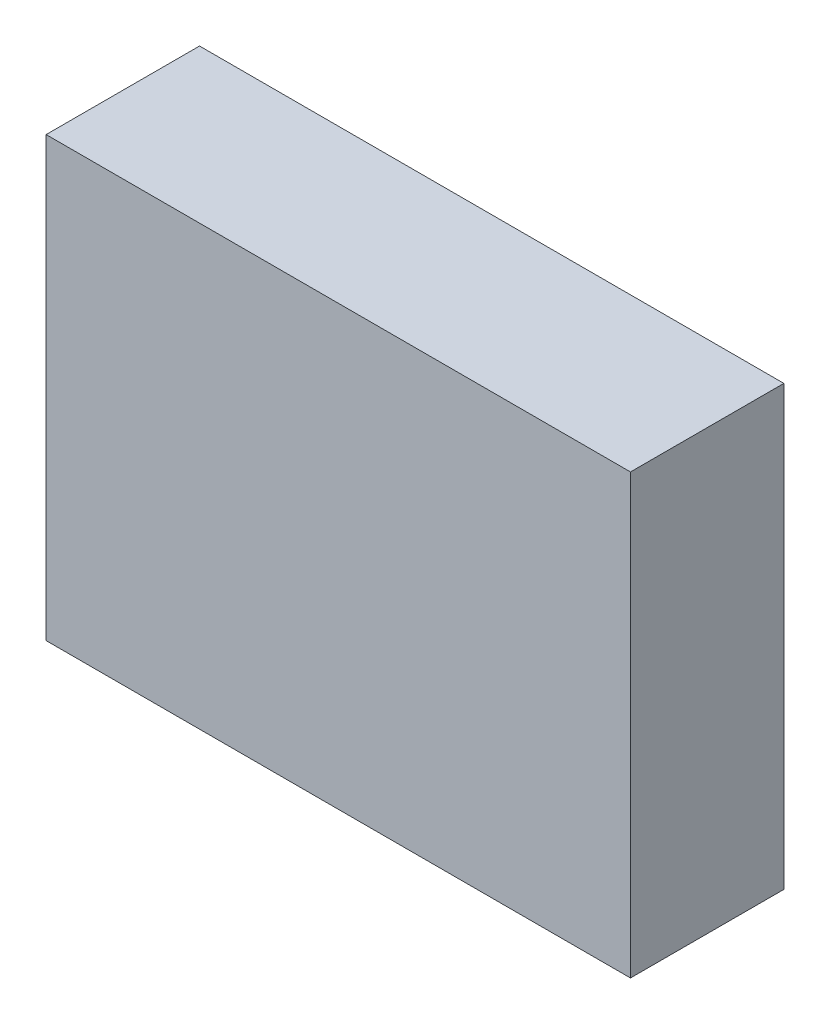
ISO-10303-21;
HEADER;
FILE_DESCRIPTION(('STEP AP214'),'2;1');
FILE_NAME('part.step','',(''),(''),'','','');
FILE_SCHEMA(('AUTOMOTIVE_DESIGN { 1 0 10303 214 1 1 1 1 }'));
ENDSEC;
DATA;
#1=APPLICATION_CONTEXT('core data for automotive mechanical design processes');
#2=APPLICATION_PROTOCOL_DEFINITION('international standard','automotive_design',2000,#1);
#3=PRODUCT_CONTEXT('',#1,'mechanical');
#4=PRODUCT('Part','Part','',(#3));
#5=PRODUCT_RELATED_PRODUCT_CATEGORY('part','',(#4));
#6=PRODUCT_DEFINITION_FORMATION('','',#4);
#7=PRODUCT_DEFINITION_CONTEXT('part definition',#1,'design');
#8=PRODUCT_DEFINITION('design','',#6,#7);
#9=PRODUCT_DEFINITION_SHAPE('','',#8);
#10=(LENGTH_UNIT() NAMED_UNIT(*) SI_UNIT(.MILLI.,.METRE.));
#11=(NAMED_UNIT(*) PLANE_ANGLE_UNIT() SI_UNIT($,.RADIAN.));
#12=(NAMED_UNIT(*) SI_UNIT($,.STERADIAN.) SOLID_ANGLE_UNIT());
#13=UNCERTAINTY_MEASURE_WITH_UNIT(LENGTH_MEASURE(1.E-05),#10,'distance_accuracy_value','');
#14=(GEOMETRIC_REPRESENTATION_CONTEXT(3) GLOBAL_UNCERTAINTY_ASSIGNED_CONTEXT((#13)) GLOBAL_UNIT_ASSIGNED_CONTEXT((#10,
#11,#12)) REPRESENTATION_CONTEXT('',''));
#15=CARTESIAN_POINT('',(0.,0.,0.));
#16=DIRECTION('',(0.,0.,1.));
#17=DIRECTION('',(1.,0.,0.));
#18=AXIS2_PLACEMENT_3D('',#15,#16,#17);
#19=CARTESIAN_POINT('',(40.,30.,21.));
#20=DIRECTION('',(-1.,0.,0.));
#21=DIRECTION('',(0.,0.,1.));
#22=AXIS2_PLACEMENT_3D('',#19,#20,#21);
#23=PLANE('',#22);
#24=DIRECTION('',(0.,1.,0.));
#25=VECTOR('',#24,1.);
#26=CARTESIAN_POINT('',(40.,30.,0.));
#27=LINE('',#26,#25);
#28=CARTESIAN_POINT('',(40.,-30.,0.));
#29=VERTEX_POINT('',#28);
#30=CARTESIAN_POINT('',(40.,30.,0.));
#31=VERTEX_POINT('',#30);
#32=EDGE_CURVE('E103',#29,#31,#27,.T.);
#33=ORIENTED_EDGE('',*,*,#32,.T.);
#34=DIRECTION('',(0.,0.,-1.));
#35=VECTOR('',#34,1.);
#36=CARTESIAN_POINT('',(40.,30.,21.));
#37=LINE('',#36,#35);
#38=CARTESIAN_POINT('',(40.,30.,21.));
#39=VERTEX_POINT('',#38);
#40=EDGE_CURVE('E11',#39,#31,#37,.T.);
#41=ORIENTED_EDGE('',*,*,#40,.F.);
#42=DIRECTION('',(0.,1.,0.));
#43=VECTOR('',#42,1.);
#44=CARTESIAN_POINT('',(40.,30.,21.));
#45=LINE('',#44,#43);
#46=CARTESIAN_POINT('',(40.,-30.,21.));
#47=VERTEX_POINT('',#46);
#48=EDGE_CURVE('E91',#47,#39,#45,.T.);
#49=ORIENTED_EDGE('',*,*,#48,.F.);
#50=DIRECTION('',(0.,0.,-1.));
#51=VECTOR('',#50,1.);
#52=CARTESIAN_POINT('',(40.,-30.,21.));
#53=LINE('',#52,#51);
#54=EDGE_CURVE('E99',#47,#29,#53,.T.);
#55=ORIENTED_EDGE('',*,*,#54,.T.);
#56=EDGE_LOOP('',(#33,#41,#49,#55));
#57=FACE_BOUND('',#56,.T.);
#58=ADVANCED_FACE('F40',(#57),#23,.F.);
#59=CARTESIAN_POINT('',(-40.,30.,21.));
#60=DIRECTION('',(0.,-1.,0.));
#61=DIRECTION('',(0.,0.,-1.));
#62=AXIS2_PLACEMENT_3D('',#59,#60,#61);
#63=PLANE('',#62);
#64=DIRECTION('',(-1.,0.,0.));
#65=VECTOR('',#64,1.);
#66=CARTESIAN_POINT('',(-40.,30.,0.));
#67=LINE('',#66,#65);
#68=CARTESIAN_POINT('',(-40.,30.,0.));
#69=VERTEX_POINT('',#68);
#70=EDGE_CURVE('E95',#31,#69,#67,.T.);
#71=ORIENTED_EDGE('',*,*,#70,.T.);
#72=DIRECTION('',(0.,0.,-1.));
#73=VECTOR('',#72,1.);
#74=CARTESIAN_POINT('',(-40.,30.,21.));
#75=LINE('',#74,#73);
#76=CARTESIAN_POINT('',(-40.,30.,21.));
#77=VERTEX_POINT('',#76);
#78=EDGE_CURVE('E48',#77,#69,#75,.T.);
#79=ORIENTED_EDGE('',*,*,#78,.F.);
#80=DIRECTION('',(-1.,0.,0.));
#81=VECTOR('',#80,1.);
#82=CARTESIAN_POINT('',(-40.,30.,21.));
#83=LINE('',#82,#81);
#84=EDGE_CURVE('E86',#39,#77,#83,.T.);
#85=ORIENTED_EDGE('',*,*,#84,.F.);
#86=ORIENTED_EDGE('',*,*,#40,.T.);
#87=EDGE_LOOP('',(#71,#79,#85,#86));
#88=FACE_BOUND('',#87,.T.);
#89=ADVANCED_FACE('F94',(#88),#63,.F.);
#90=CARTESIAN_POINT('',(-40.,30.,21.));
#91=DIRECTION('',(1.,0.,0.));
#92=DIRECTION('',(0.,1.,0.));
#93=AXIS2_PLACEMENT_3D('',#90,#91,#92);
#94=PLANE('',#93);
#95=DIRECTION('',(0.,-1.,0.));
#96=VECTOR('',#95,1.);
#97=CARTESIAN_POINT('',(-40.,30.,0.));
#98=LINE('',#97,#96);
#99=CARTESIAN_POINT('',(-40.,-30.,0.));
#100=VERTEX_POINT('',#99);
#101=EDGE_CURVE('E73',#69,#100,#98,.T.);
#102=ORIENTED_EDGE('',*,*,#101,.T.);
#103=DIRECTION('',(0.,0.,-1.));
#104=VECTOR('',#103,1.);
#105=CARTESIAN_POINT('',(-40.,-30.,21.));
#106=LINE('',#105,#104);
#107=CARTESIAN_POINT('',(-40.,-30.,21.));
#108=VERTEX_POINT('',#107);
#109=EDGE_CURVE('E96',#108,#100,#106,.T.);
#110=ORIENTED_EDGE('',*,*,#109,.F.);
#111=DIRECTION('',(0.,-1.,0.));
#112=VECTOR('',#111,1.);
#113=CARTESIAN_POINT('',(-40.,30.,21.));
#114=LINE('',#113,#112);
#115=EDGE_CURVE('E89',#77,#108,#114,.T.);
#116=ORIENTED_EDGE('',*,*,#115,.F.);
#117=ORIENTED_EDGE('',*,*,#78,.T.);
#118=EDGE_LOOP('',(#102,#110,#116,#117));
#119=FACE_BOUND('',#118,.T.);
#120=ADVANCED_FACE('F97',(#119),#94,.F.);
#121=CARTESIAN_POINT('',(-40.,-30.,21.));
#122=DIRECTION('',(0.,1.,0.));
#123=DIRECTION('',(0.,0.,1.));
#124=AXIS2_PLACEMENT_3D('',#121,#122,#123);
#125=PLANE('',#124);
#126=DIRECTION('',(1.,0.,0.));
#127=VECTOR('',#126,1.);
#128=CARTESIAN_POINT('',(-40.,-30.,0.));
#129=LINE('',#128,#127);
#130=EDGE_CURVE('E79',#100,#29,#129,.T.);
#131=ORIENTED_EDGE('',*,*,#130,.T.);
#132=ORIENTED_EDGE('',*,*,#54,.F.);
#133=DIRECTION('',(1.,0.,0.));
#134=VECTOR('',#133,1.);
#135=CARTESIAN_POINT('',(-40.,-30.,21.));
#136=LINE('',#135,#134);
#137=EDGE_CURVE('E56',#108,#47,#136,.T.);
#138=ORIENTED_EDGE('',*,*,#137,.F.);
#139=ORIENTED_EDGE('',*,*,#109,.T.);
#140=EDGE_LOOP('',(#131,#132,#138,#139));
#141=FACE_BOUND('',#140,.T.);
#142=ADVANCED_FACE('F110',(#141),#125,.F.);
#143=CARTESIAN_POINT('',(0.,0.,21.));
#144=DIRECTION('',(0.,0.,1.));
#145=DIRECTION('',(1.,0.,0.));
#146=AXIS2_PLACEMENT_3D('',#143,#144,#145);
#147=PLANE('',#146);
#148=ORIENTED_EDGE('',*,*,#48,.T.);
#149=ORIENTED_EDGE('',*,*,#84,.T.);
#150=ORIENTED_EDGE('',*,*,#115,.T.);
#151=ORIENTED_EDGE('',*,*,#137,.T.);
#152=EDGE_LOOP('',(#148,#149,#150,#151));
#153=FACE_BOUND('',#152,.T.);
#154=ADVANCED_FACE('F87',(#153),#147,.T.);
#155=CARTESIAN_POINT('',(0.,0.,0.));
#156=DIRECTION('',(0.,0.,1.));
#157=DIRECTION('',(1.,0.,0.));
#158=AXIS2_PLACEMENT_3D('',#155,#156,#157);
#159=PLANE('',#158);
#160=ORIENTED_EDGE('',*,*,#32,.F.);
#161=ORIENTED_EDGE('',*,*,#130,.F.);
#162=ORIENTED_EDGE('',*,*,#101,.F.);
#163=ORIENTED_EDGE('',*,*,#70,.F.);
#164=EDGE_LOOP('',(#160,#161,#162,#163));
#165=FACE_BOUND('',#164,.T.);
#166=ADVANCED_FACE('F113',(#165),#159,.F.);
#167=CLOSED_SHELL('',(#58,#89,#120,#142,#154,#166));
#168=MANIFOLD_SOLID_BREP('B2',#167);
#169=ADVANCED_BREP_SHAPE_REPRESENTATION('',(#18,#168),#14);
#170=SHAPE_DEFINITION_REPRESENTATION(#9,#169);
ENDSEC;
END-ISO-10303-21;
